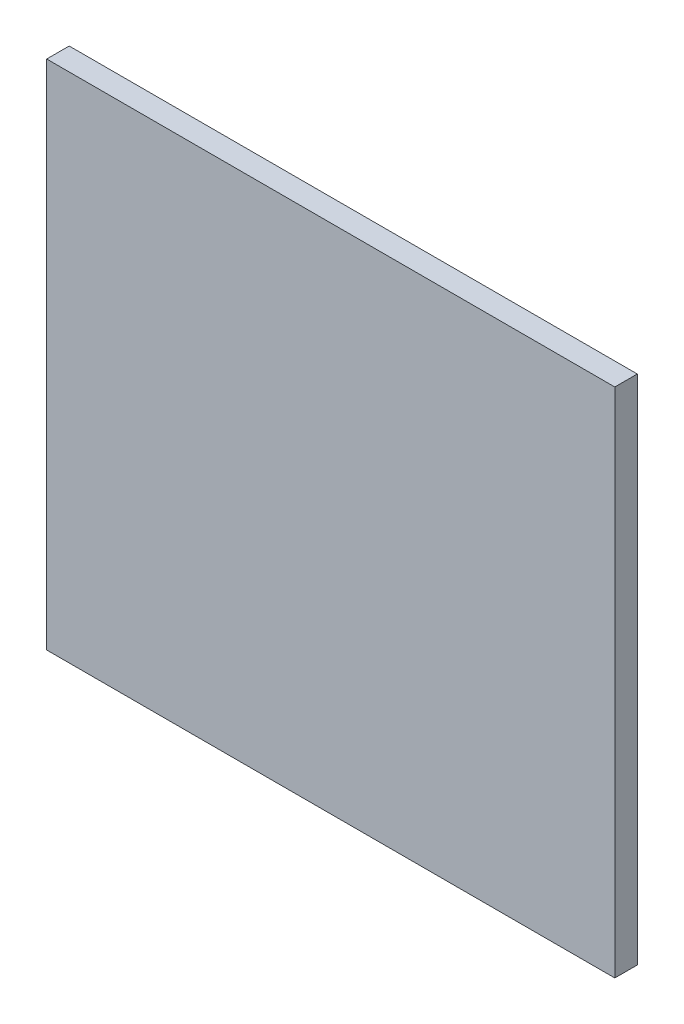
ISO-10303-21;
HEADER;
FILE_DESCRIPTION(('STEP AP214'),'2;1');
FILE_NAME('part.step','',(''),(''),'','','');
FILE_SCHEMA(('AUTOMOTIVE_DESIGN { 1 0 10303 214 1 1 1 1 }'));
ENDSEC;
DATA;
#1=APPLICATION_CONTEXT('core data for automotive mechanical design processes');
#2=APPLICATION_PROTOCOL_DEFINITION('international standard','automotive_design',2000,#1);
#3=PRODUCT_CONTEXT('',#1,'mechanical');
#4=PRODUCT('Part','Part','',(#3));
#5=PRODUCT_RELATED_PRODUCT_CATEGORY('part','',(#4));
#6=PRODUCT_DEFINITION_FORMATION('','',#4);
#7=PRODUCT_DEFINITION_CONTEXT('part definition',#1,'design');
#8=PRODUCT_DEFINITION('design','',#6,#7);
#9=PRODUCT_DEFINITION_SHAPE('','',#8);
#10=(LENGTH_UNIT() NAMED_UNIT(*) SI_UNIT(.MILLI.,.METRE.));
#11=(NAMED_UNIT(*) PLANE_ANGLE_UNIT() SI_UNIT($,.RADIAN.));
#12=(NAMED_UNIT(*) SI_UNIT($,.STERADIAN.) SOLID_ANGLE_UNIT());
#13=UNCERTAINTY_MEASURE_WITH_UNIT(LENGTH_MEASURE(1.E-05),#10,'distance_accuracy_value','');
#14=(GEOMETRIC_REPRESENTATION_CONTEXT(3) GLOBAL_UNCERTAINTY_ASSIGNED_CONTEXT((#13)) GLOBAL_UNIT_ASSIGNED_CONTEXT((#10,
#11,#12)) REPRESENTATION_CONTEXT('',''));
#15=CARTESIAN_POINT('',(0.,0.,0.));
#16=DIRECTION('',(0.,0.,1.));
#17=DIRECTION('',(1.,0.,0.));
#18=AXIS2_PLACEMENT_3D('',#15,#16,#17);
#19=CARTESIAN_POINT('',(0.,0.,2.));
#20=DIRECTION('',(1.,0.,0.));
#21=DIRECTION('',(0.,0.,-1.));
#22=AXIS2_PLACEMENT_3D('',#19,#20,#21);
#23=PLANE('',#22);
#24=DIRECTION('',(0.,-1.,0.));
#25=VECTOR('',#24,1.);
#26=CARTESIAN_POINT('',(0.,0.,0.));
#27=LINE('',#26,#25);
#28=CARTESIAN_POINT('',(0.,45.5,0.));
#29=VERTEX_POINT('',#28);
#30=CARTESIAN_POINT('',(0.,0.,0.));
#31=VERTEX_POINT('',#30);
#32=EDGE_CURVE('E107',#29,#31,#27,.T.);
#33=ORIENTED_EDGE('',*,*,#32,.T.);
#34=DIRECTION('',(0.,0.,-1.));
#35=VECTOR('',#34,1.);
#36=CARTESIAN_POINT('',(0.,0.,2.));
#37=LINE('',#36,#35);
#38=CARTESIAN_POINT('',(0.,0.,2.));
#39=VERTEX_POINT('',#38);
#40=EDGE_CURVE('E11',#39,#31,#37,.T.);
#41=ORIENTED_EDGE('',*,*,#40,.F.);
#42=DIRECTION('',(0.,-1.,0.));
#43=VECTOR('',#42,1.);
#44=CARTESIAN_POINT('',(0.,0.,2.));
#45=LINE('',#44,#43);
#46=CARTESIAN_POINT('',(0.,45.5,2.));
#47=VERTEX_POINT('',#46);
#48=EDGE_CURVE('E91',#47,#39,#45,.T.);
#49=ORIENTED_EDGE('',*,*,#48,.F.);
#50=DIRECTION('',(0.,0.,-1.));
#51=VECTOR('',#50,1.);
#52=CARTESIAN_POINT('',(0.,45.5,2.));
#53=LINE('',#52,#51);
#54=EDGE_CURVE('E103',#47,#29,#53,.T.);
#55=ORIENTED_EDGE('',*,*,#54,.T.);
#56=EDGE_LOOP('',(#33,#41,#49,#55));
#57=FACE_BOUND('',#56,.T.);
#58=ADVANCED_FACE('F39',(#57),#23,.F.);
#59=CARTESIAN_POINT('',(0.,0.,2.));
#60=DIRECTION('',(0.,1.,0.));
#61=DIRECTION('',(0.,0.,1.));
#62=AXIS2_PLACEMENT_3D('',#59,#60,#61);
#63=PLANE('',#62);
#64=DIRECTION('',(1.,0.,0.));
#65=VECTOR('',#64,1.);
#66=CARTESIAN_POINT('',(0.,0.,0.));
#67=LINE('',#66,#65);
#68=CARTESIAN_POINT('',(50.5,0.,0.));
#69=VERTEX_POINT('',#68);
#70=EDGE_CURVE('E96',#31,#69,#67,.T.);
#71=ORIENTED_EDGE('',*,*,#70,.T.);
#72=DIRECTION('',(0.,0.,-1.));
#73=VECTOR('',#72,1.);
#74=CARTESIAN_POINT('',(50.5,0.,2.));
#75=LINE('',#74,#73);
#76=CARTESIAN_POINT('',(50.5,0.,2.));
#77=VERTEX_POINT('',#76);
#78=EDGE_CURVE('E48',#77,#69,#75,.T.);
#79=ORIENTED_EDGE('',*,*,#78,.F.);
#80=DIRECTION('',(1.,0.,0.));
#81=VECTOR('',#80,1.);
#82=CARTESIAN_POINT('',(0.,0.,2.));
#83=LINE('',#82,#81);
#84=EDGE_CURVE('E86',#39,#77,#83,.T.);
#85=ORIENTED_EDGE('',*,*,#84,.F.);
#86=ORIENTED_EDGE('',*,*,#40,.T.);
#87=EDGE_LOOP('',(#71,#79,#85,#86));
#88=FACE_BOUND('',#87,.T.);
#89=ADVANCED_FACE('F95',(#88),#63,.F.);
#90=CARTESIAN_POINT('',(50.5,0.,2.));
#91=DIRECTION('',(-1.,0.,0.));
#92=DIRECTION('',(0.,0.,1.));
#93=AXIS2_PLACEMENT_3D('',#90,#91,#92);
#94=PLANE('',#93);
#95=DIRECTION('',(0.,1.,0.));
#96=VECTOR('',#95,1.);
#97=CARTESIAN_POINT('',(50.5,0.,0.));
#98=LINE('',#97,#96);
#99=CARTESIAN_POINT('',(50.5,45.5,0.));
#100=VERTEX_POINT('',#99);
#101=EDGE_CURVE('E73',#69,#100,#98,.T.);
#102=ORIENTED_EDGE('',*,*,#101,.T.);
#103=DIRECTION('',(0.,0.,-1.));
#104=VECTOR('',#103,1.);
#105=CARTESIAN_POINT('',(50.5,45.5,2.));
#106=LINE('',#105,#104);
#107=CARTESIAN_POINT('',(50.5,45.5,2.));
#108=VERTEX_POINT('',#107);
#109=EDGE_CURVE('E98',#108,#100,#106,.T.);
#110=ORIENTED_EDGE('',*,*,#109,.F.);
#111=DIRECTION('',(0.,1.,0.));
#112=VECTOR('',#111,1.);
#113=CARTESIAN_POINT('',(50.5,0.,2.));
#114=LINE('',#113,#112);
#115=EDGE_CURVE('E89',#77,#108,#114,.T.);
#116=ORIENTED_EDGE('',*,*,#115,.F.);
#117=ORIENTED_EDGE('',*,*,#78,.T.);
#118=EDGE_LOOP('',(#102,#110,#116,#117));
#119=FACE_BOUND('',#118,.T.);
#120=ADVANCED_FACE('F99',(#119),#94,.F.);
#121=CARTESIAN_POINT('',(0.,45.5,2.));
#122=DIRECTION('',(0.,-1.,0.));
#123=DIRECTION('',(0.,0.,-1.));
#124=AXIS2_PLACEMENT_3D('',#121,#122,#123);
#125=PLANE('',#124);
#126=DIRECTION('',(-1.,0.,0.));
#127=VECTOR('',#126,1.);
#128=CARTESIAN_POINT('',(0.,45.5,0.));
#129=LINE('',#128,#127);
#130=EDGE_CURVE('E79',#100,#29,#129,.T.);
#131=ORIENTED_EDGE('',*,*,#130,.T.);
#132=ORIENTED_EDGE('',*,*,#54,.F.);
#133=DIRECTION('',(-1.,0.,0.));
#134=VECTOR('',#133,1.);
#135=CARTESIAN_POINT('',(0.,45.5,2.));
#136=LINE('',#135,#134);
#137=EDGE_CURVE('E56',#108,#47,#136,.T.);
#138=ORIENTED_EDGE('',*,*,#137,.F.);
#139=ORIENTED_EDGE('',*,*,#109,.T.);
#140=EDGE_LOOP('',(#131,#132,#138,#139));
#141=FACE_BOUND('',#140,.T.);
#142=ADVANCED_FACE('F120',(#141),#125,.F.);
#143=CARTESIAN_POINT('',(0.,0.,2.));
#144=DIRECTION('',(0.,0.,-1.));
#145=DIRECTION('',(-1.,0.,0.));
#146=AXIS2_PLACEMENT_3D('',#143,#144,#145);
#147=PLANE('',#146);
#148=ORIENTED_EDGE('',*,*,#48,.T.);
#149=ORIENTED_EDGE('',*,*,#84,.T.);
#150=ORIENTED_EDGE('',*,*,#115,.T.);
#151=ORIENTED_EDGE('',*,*,#137,.T.);
#152=EDGE_LOOP('',(#148,#149,#150,#151));
#153=FACE_BOUND('',#152,.T.);
#154=ADVANCED_FACE('F87',(#153),#147,.F.);
#155=CARTESIAN_POINT('',(0.,0.,0.));
#156=DIRECTION('',(0.,0.,-1.));
#157=DIRECTION('',(-1.,0.,0.));
#158=AXIS2_PLACEMENT_3D('',#155,#156,#157);
#159=PLANE('',#158);
#160=ORIENTED_EDGE('',*,*,#32,.F.);
#161=ORIENTED_EDGE('',*,*,#130,.F.);
#162=ORIENTED_EDGE('',*,*,#101,.F.);
#163=ORIENTED_EDGE('',*,*,#70,.F.);
#164=EDGE_LOOP('',(#160,#161,#162,#163));
#165=FACE_BOUND('',#164,.T.);
#166=ADVANCED_FACE('F123',(#165),#159,.T.);
#167=CLOSED_SHELL('',(#58,#89,#120,#142,#154,#166));
#168=MANIFOLD_SOLID_BREP('B2',#167);
#169=ADVANCED_BREP_SHAPE_REPRESENTATION('',(#18,#168),#14);
#170=SHAPE_DEFINITION_REPRESENTATION(#9,#169);
ENDSEC;
END-ISO-10303-21;
